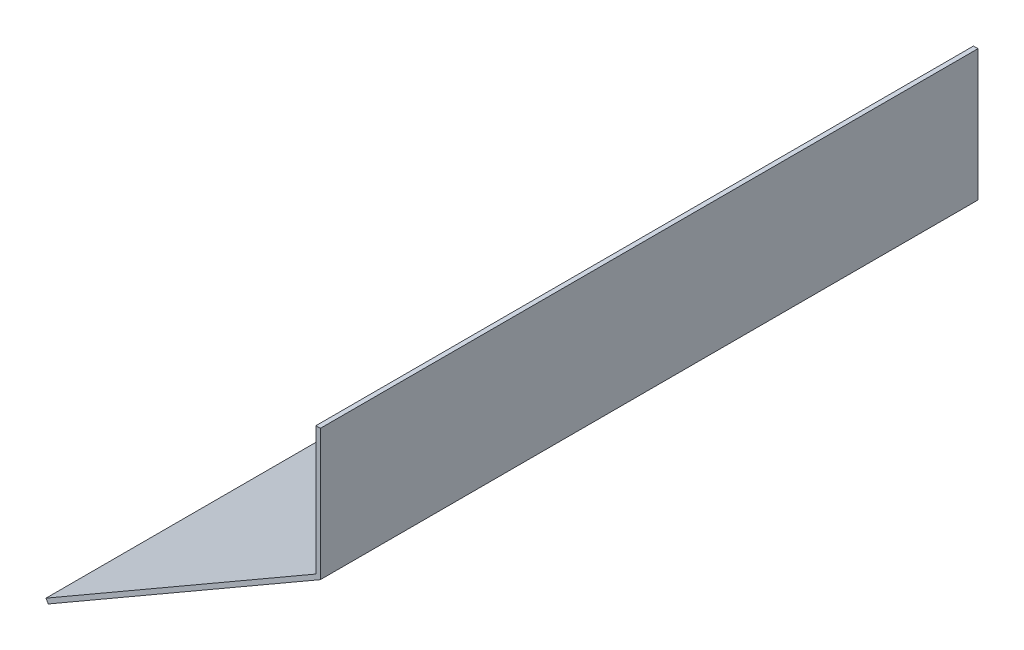
ISO-10303-21;
HEADER;
FILE_DESCRIPTION(('STEP AP214'),'2;1');
FILE_NAME('part.step','',(''),(''),'','','');
FILE_SCHEMA(('AUTOMOTIVE_DESIGN { 1 0 10303 214 1 1 1 1 }'));
ENDSEC;
DATA;
#1=APPLICATION_CONTEXT('core data for automotive mechanical design processes');
#2=APPLICATION_PROTOCOL_DEFINITION('international standard','automotive_design',2000,#1);
#3=PRODUCT_CONTEXT('',#1,'mechanical');
#4=PRODUCT('Part','Part','',(#3));
#5=PRODUCT_RELATED_PRODUCT_CATEGORY('part','',(#4));
#6=PRODUCT_DEFINITION_FORMATION('','',#4);
#7=PRODUCT_DEFINITION_CONTEXT('part definition',#1,'design');
#8=PRODUCT_DEFINITION('design','',#6,#7);
#9=PRODUCT_DEFINITION_SHAPE('','',#8);
#10=(LENGTH_UNIT() NAMED_UNIT(*) SI_UNIT(.MILLI.,.METRE.));
#11=(NAMED_UNIT(*) PLANE_ANGLE_UNIT() SI_UNIT($,.RADIAN.));
#12=(NAMED_UNIT(*) SI_UNIT($,.STERADIAN.) SOLID_ANGLE_UNIT());
#13=UNCERTAINTY_MEASURE_WITH_UNIT(LENGTH_MEASURE(1.E-05),#10,'distance_accuracy_value','');
#14=(GEOMETRIC_REPRESENTATION_CONTEXT(3) GLOBAL_UNCERTAINTY_ASSIGNED_CONTEXT((#13)) GLOBAL_UNIT_ASSIGNED_CONTEXT((#10,
#11,#12)) REPRESENTATION_CONTEXT('',''));
#15=CARTESIAN_POINT('',(0.,0.,0.));
#16=DIRECTION('',(0.,0.,1.));
#17=DIRECTION('',(1.,0.,0.));
#18=AXIS2_PLACEMENT_3D('',#15,#16,#17);
#19=CARTESIAN_POINT('',(-64.7167809239941,-46.1347333709072,290.));
#20=DIRECTION('',(0.866025403784439,0.5,0.));
#21=DIRECTION('',(-0.5,0.866025403784439,0.));
#22=AXIS2_PLACEMENT_3D('',#19,#20,#21);
#23=PLANE('',#22);
#24=DIRECTION('',(0.5,-0.866025403784439,0.));
#25=VECTOR('',#24,1.);
#26=CARTESIAN_POINT('',(-64.7167809239941,-46.1347333709072,0.));
#27=LINE('',#26,#25);
#28=CARTESIAN_POINT('',(-65.7167809239941,-44.4026825633383,0.));
#29=VERTEX_POINT('',#28);
#30=CARTESIAN_POINT('',(-64.7167809239941,-46.1347333709072,0.));
#31=VERTEX_POINT('',#30);
#32=EDGE_CURVE('E125',#29,#31,#27,.T.);
#33=ORIENTED_EDGE('',*,*,#32,.T.);
#34=DIRECTION('',(0.,0.,-1.));
#35=VECTOR('',#34,1.);
#36=CARTESIAN_POINT('',(-64.7167809239941,-46.1347333709072,290.));
#37=LINE('',#36,#35);
#38=CARTESIAN_POINT('',(-64.7167809239941,-46.1347333709072,290.));
#39=VERTEX_POINT('',#38);
#40=EDGE_CURVE('E11',#39,#31,#37,.T.);
#41=ORIENTED_EDGE('',*,*,#40,.F.);
#42=DIRECTION('',(0.5,-0.866025403784439,0.));
#43=VECTOR('',#42,1.);
#44=CARTESIAN_POINT('',(-64.7167809239941,-46.1347333709072,290.));
#45=LINE('',#44,#43);
#46=CARTESIAN_POINT('',(-65.7167809239941,-44.4026825633383,290.));
#47=VERTEX_POINT('',#46);
#48=EDGE_CURVE('E135',#47,#39,#45,.T.);
#49=ORIENTED_EDGE('',*,*,#48,.F.);
#50=DIRECTION('',(0.,0.,-1.));
#51=VECTOR('',#50,1.);
#52=CARTESIAN_POINT('',(-65.7167809239941,-44.4026825633383,290.));
#53=LINE('',#52,#51);
#54=EDGE_CURVE('E121',#47,#29,#53,.T.);
#55=ORIENTED_EDGE('',*,*,#54,.T.);
#56=EDGE_LOOP('',(#33,#41,#49,#55));
#57=FACE_BOUND('',#56,.T.);
#58=ADVANCED_FACE('F41',(#57),#23,.F.);
#59=CARTESIAN_POINT('',(-64.7167809239941,-46.1347333709072,290.));
#60=DIRECTION('',(-0.499999999999998,0.86602540378444,0.));
#61=DIRECTION('',(-0.86602540378444,-0.499999999999998,0.));
#62=AXIS2_PLACEMENT_3D('',#59,#60,#61);
#63=PLANE('',#62);
#64=DIRECTION('',(0.86602540378444,0.499999999999998,0.));
#65=VECTOR('',#64,1.);
#66=CARTESIAN_POINT('',(-64.7167809239941,-46.1347333709072,0.));
#67=LINE('',#66,#65);
#68=CARTESIAN_POINT('',(55.283219076006,23.1472989318475,0.));
#69=VERTEX_POINT('',#68);
#70=EDGE_CURVE('E128',#31,#69,#67,.T.);
#71=ORIENTED_EDGE('',*,*,#70,.T.);
#72=DIRECTION('',(0.,0.,-1.));
#73=VECTOR('',#72,1.);
#74=CARTESIAN_POINT('',(55.283219076006,23.1472989318475,290.));
#75=LINE('',#74,#73);
#76=CARTESIAN_POINT('',(55.283219076006,23.1472989318475,290.));
#77=VERTEX_POINT('',#76);
#78=EDGE_CURVE('E49',#77,#69,#75,.T.);
#79=ORIENTED_EDGE('',*,*,#78,.F.);
#80=DIRECTION('',(0.86602540378444,0.499999999999998,0.));
#81=VECTOR('',#80,1.);
#82=CARTESIAN_POINT('',(-64.7167809239941,-46.1347333709072,290.));
#83=LINE('',#82,#81);
#84=EDGE_CURVE('E94',#39,#77,#83,.T.);
#85=ORIENTED_EDGE('',*,*,#84,.F.);
#86=ORIENTED_EDGE('',*,*,#40,.T.);
#87=EDGE_LOOP('',(#71,#79,#85,#86));
#88=FACE_BOUND('',#87,.T.);
#89=ADVANCED_FACE('F159',(#88),#63,.F.);
#90=CARTESIAN_POINT('',(55.283219076006,23.1472989318475,290.));
#91=DIRECTION('',(-1.,0.,0.));
#92=DIRECTION('',(0.,-1.,0.));
#93=AXIS2_PLACEMENT_3D('',#90,#91,#92);
#94=PLANE('',#93);
#95=DIRECTION('',(0.,1.,0.));
#96=VECTOR('',#95,1.);
#97=CARTESIAN_POINT('',(55.283219076006,23.1472989318475,0.));
#98=LINE('',#97,#96);
#99=CARTESIAN_POINT('',(55.2832190760059,80.9544560357675,0.));
#100=VERTEX_POINT('',#99);
#101=EDGE_CURVE('E130',#69,#100,#98,.T.);
#102=ORIENTED_EDGE('',*,*,#101,.T.);
#103=DIRECTION('',(0.,0.,-1.));
#104=VECTOR('',#103,1.);
#105=CARTESIAN_POINT('',(55.2832190760059,80.9544560357675,290.));
#106=LINE('',#105,#104);
#107=CARTESIAN_POINT('',(55.2832190760059,80.9544560357675,290.));
#108=VERTEX_POINT('',#107);
#109=EDGE_CURVE('E116',#108,#100,#106,.T.);
#110=ORIENTED_EDGE('',*,*,#109,.F.);
#111=DIRECTION('',(0.,1.,0.));
#112=VECTOR('',#111,1.);
#113=CARTESIAN_POINT('',(55.283219076006,23.1472989318475,290.));
#114=LINE('',#113,#112);
#115=EDGE_CURVE('E107',#77,#108,#114,.T.);
#116=ORIENTED_EDGE('',*,*,#115,.F.);
#117=ORIENTED_EDGE('',*,*,#78,.T.);
#118=EDGE_LOOP('',(#102,#110,#116,#117));
#119=FACE_BOUND('',#118,.T.);
#120=ADVANCED_FACE('F141',(#119),#94,.F.);
#121=CARTESIAN_POINT('',(53.2832190760059,80.9544560357675,290.));
#122=DIRECTION('',(0.,-1.,0.));
#123=DIRECTION('',(0.,0.,-1.));
#124=AXIS2_PLACEMENT_3D('',#121,#122,#123);
#125=PLANE('',#124);
#126=DIRECTION('',(-1.,0.,0.));
#127=VECTOR('',#126,1.);
#128=CARTESIAN_POINT('',(53.2832190760059,80.9544560357675,0.));
#129=LINE('',#128,#127);
#130=CARTESIAN_POINT('',(53.2832190760059,80.9544560357675,0.));
#131=VERTEX_POINT('',#130);
#132=EDGE_CURVE('E115',#100,#131,#129,.T.);
#133=ORIENTED_EDGE('',*,*,#132,.T.);
#134=DIRECTION('',(0.,0.,-1.));
#135=VECTOR('',#134,1.);
#136=CARTESIAN_POINT('',(53.2832190760059,80.9544560357675,290.));
#137=LINE('',#136,#135);
#138=CARTESIAN_POINT('',(53.2832190760059,80.9544560357675,290.));
#139=VERTEX_POINT('',#138);
#140=EDGE_CURVE('E112',#139,#131,#137,.T.);
#141=ORIENTED_EDGE('',*,*,#140,.F.);
#142=DIRECTION('',(-1.,0.,0.));
#143=VECTOR('',#142,1.);
#144=CARTESIAN_POINT('',(53.2832190760059,80.9544560357675,290.));
#145=LINE('',#144,#143);
#146=EDGE_CURVE('E101',#108,#139,#145,.T.);
#147=ORIENTED_EDGE('',*,*,#146,.F.);
#148=ORIENTED_EDGE('',*,*,#109,.T.);
#149=EDGE_LOOP('',(#133,#141,#147,#148));
#150=FACE_BOUND('',#149,.T.);
#151=ADVANCED_FACE('F113',(#150),#125,.F.);
#152=CARTESIAN_POINT('',(53.283219076006,24.3019994702268,290.));
#153=DIRECTION('',(1.,0.,0.));
#154=DIRECTION('',(0.,1.,0.));
#155=AXIS2_PLACEMENT_3D('',#152,#153,#154);
#156=PLANE('',#155);
#157=DIRECTION('',(0.,-1.,0.));
#158=VECTOR('',#157,1.);
#159=CARTESIAN_POINT('',(53.283219076006,24.3019994702268,0.));
#160=LINE('',#159,#158);
#161=CARTESIAN_POINT('',(53.283219076006,24.3019994702268,0.));
#162=VERTEX_POINT('',#161);
#163=EDGE_CURVE('E80',#131,#162,#160,.T.);
#164=ORIENTED_EDGE('',*,*,#163,.T.);
#165=DIRECTION('',(0.,0.,-1.));
#166=VECTOR('',#165,1.);
#167=CARTESIAN_POINT('',(53.283219076006,24.3019994702268,290.));
#168=LINE('',#167,#166);
#169=CARTESIAN_POINT('',(53.283219076006,24.3019994702268,290.));
#170=VERTEX_POINT('',#169);
#171=EDGE_CURVE('E117',#170,#162,#168,.T.);
#172=ORIENTED_EDGE('',*,*,#171,.F.);
#173=DIRECTION('',(0.,-1.,0.));
#174=VECTOR('',#173,1.);
#175=CARTESIAN_POINT('',(53.283219076006,24.3019994702268,290.));
#176=LINE('',#175,#174);
#177=EDGE_CURVE('E105',#139,#170,#176,.T.);
#178=ORIENTED_EDGE('',*,*,#177,.F.);
#179=ORIENTED_EDGE('',*,*,#140,.T.);
#180=EDGE_LOOP('',(#164,#172,#178,#179));
#181=FACE_BOUND('',#180,.T.);
#182=ADVANCED_FACE('F119',(#181),#156,.F.);
#183=CARTESIAN_POINT('',(-65.7167809239941,-44.4026825633383,290.));
#184=DIRECTION('',(0.499999999999998,-0.86602540378444,0.));
#185=DIRECTION('',(0.86602540378444,0.499999999999998,0.));
#186=AXIS2_PLACEMENT_3D('',#183,#184,#185);
#187=PLANE('',#186);
#188=DIRECTION('',(-0.86602540378444,-0.499999999999998,0.));
#189=VECTOR('',#188,1.);
#190=CARTESIAN_POINT('',(-65.7167809239941,-44.4026825633383,0.));
#191=LINE('',#190,#189);
#192=EDGE_CURVE('E86',#162,#29,#191,.T.);
#193=ORIENTED_EDGE('',*,*,#192,.T.);
#194=ORIENTED_EDGE('',*,*,#54,.F.);
#195=DIRECTION('',(-0.86602540378444,-0.499999999999998,0.));
#196=VECTOR('',#195,1.);
#197=CARTESIAN_POINT('',(-65.7167809239941,-44.4026825633383,290.));
#198=LINE('',#197,#196);
#199=EDGE_CURVE('E57',#170,#47,#198,.T.);
#200=ORIENTED_EDGE('',*,*,#199,.F.);
#201=ORIENTED_EDGE('',*,*,#171,.T.);
#202=EDGE_LOOP('',(#193,#194,#200,#201));
#203=FACE_BOUND('',#202,.T.);
#204=ADVANCED_FACE('F148',(#203),#187,.F.);
#205=CARTESIAN_POINT('',(0.,0.,290.));
#206=DIRECTION('',(0.,0.,-1.));
#207=DIRECTION('',(-1.,0.,0.));
#208=AXIS2_PLACEMENT_3D('',#205,#206,#207);
#209=PLANE('',#208);
#210=ORIENTED_EDGE('',*,*,#48,.T.);
#211=ORIENTED_EDGE('',*,*,#84,.T.);
#212=ORIENTED_EDGE('',*,*,#115,.T.);
#213=ORIENTED_EDGE('',*,*,#146,.T.);
#214=ORIENTED_EDGE('',*,*,#177,.T.);
#215=ORIENTED_EDGE('',*,*,#199,.T.);
#216=EDGE_LOOP('',(#210,#211,#212,#213,#214,#215));
#217=FACE_BOUND('',#216,.T.);
#218=ADVANCED_FACE('F103',(#217),#209,.F.);
#219=CARTESIAN_POINT('',(0.,0.,0.));
#220=DIRECTION('',(0.,0.,-1.));
#221=DIRECTION('',(-1.,0.,0.));
#222=AXIS2_PLACEMENT_3D('',#219,#220,#221);
#223=PLANE('',#222);
#224=ORIENTED_EDGE('',*,*,#32,.F.);
#225=ORIENTED_EDGE('',*,*,#192,.F.);
#226=ORIENTED_EDGE('',*,*,#163,.F.);
#227=ORIENTED_EDGE('',*,*,#132,.F.);
#228=ORIENTED_EDGE('',*,*,#101,.F.);
#229=ORIENTED_EDGE('',*,*,#70,.F.);
#230=EDGE_LOOP('',(#224,#225,#226,#227,#228,#229));
#231=FACE_BOUND('',#230,.T.);
#232=ADVANCED_FACE('F144',(#231),#223,.T.);
#233=CLOSED_SHELL('',(#58,#89,#120,#151,#182,#204,#218,#232));
#234=MANIFOLD_SOLID_BREP('B2',#233);
#235=ADVANCED_BREP_SHAPE_REPRESENTATION('',(#18,#234),#14);
#236=SHAPE_DEFINITION_REPRESENTATION(#9,#235);
ENDSEC;
END-ISO-10303-21;
